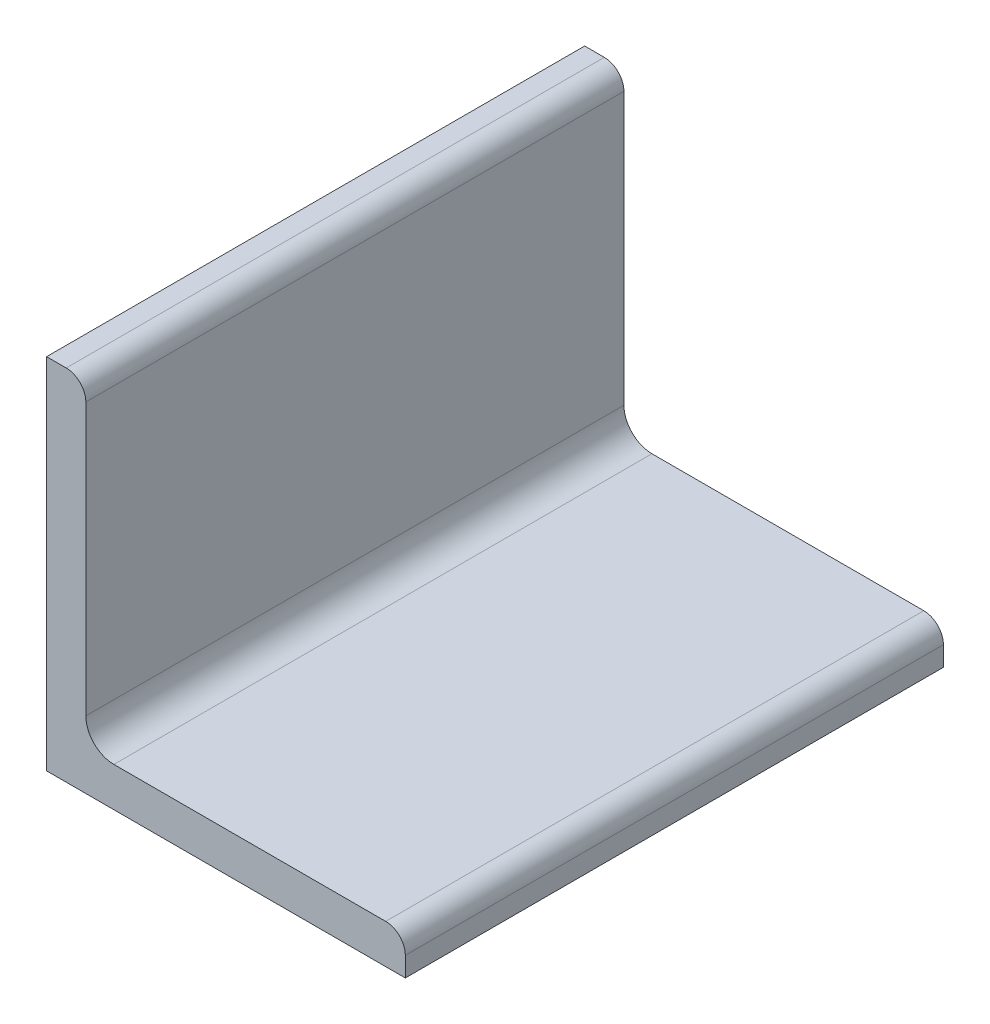
ISO-10303-21;
HEADER;
FILE_DESCRIPTION(('STEP AP214'),'2;1');
FILE_NAME('part.step','',(''),(''),'','','');
FILE_SCHEMA(('AUTOMOTIVE_DESIGN { 1 0 10303 214 1 1 1 1 }'));
ENDSEC;
DATA;
#1=APPLICATION_CONTEXT('core data for automotive mechanical design processes');
#2=APPLICATION_PROTOCOL_DEFINITION('international standard','automotive_design',2000,#1);
#3=PRODUCT_CONTEXT('',#1,'mechanical');
#4=PRODUCT('Part','Part','',(#3));
#5=PRODUCT_RELATED_PRODUCT_CATEGORY('part','',(#4));
#6=PRODUCT_DEFINITION_FORMATION('','',#4);
#7=PRODUCT_DEFINITION_CONTEXT('part definition',#1,'design');
#8=PRODUCT_DEFINITION('design','',#6,#7);
#9=PRODUCT_DEFINITION_SHAPE('','',#8);
#10=(LENGTH_UNIT() NAMED_UNIT(*) SI_UNIT(.MILLI.,.METRE.));
#11=(NAMED_UNIT(*) PLANE_ANGLE_UNIT() SI_UNIT($,.RADIAN.));
#12=(NAMED_UNIT(*) SI_UNIT($,.STERADIAN.) SOLID_ANGLE_UNIT());
#13=UNCERTAINTY_MEASURE_WITH_UNIT(LENGTH_MEASURE(1.E-05),#10,'distance_accuracy_value','');
#14=(GEOMETRIC_REPRESENTATION_CONTEXT(3) GLOBAL_UNCERTAINTY_ASSIGNED_CONTEXT((#13)) GLOBAL_UNIT_ASSIGNED_CONTEXT((#10,
#11,#12)) REPRESENTATION_CONTEXT('',''));
#15=CARTESIAN_POINT('',(0.,0.,0.));
#16=DIRECTION('',(0.,0.,1.));
#17=DIRECTION('',(1.,0.,0.));
#18=AXIS2_PLACEMENT_3D('',#15,#16,#17);
#19=CARTESIAN_POINT('',(1.17355224493876,203.678837479771,304.8));
#20=DIRECTION('',(1.,0.,0.));
#21=DIRECTION('',(0.,0.,-1.));
#22=AXIS2_PLACEMENT_3D('',#19,#20,#21);
#23=PLANE('',#22);
#24=DIRECTION('',(0.,-1.,0.));
#25=VECTOR('',#24,1.);
#26=CARTESIAN_POINT('',(1.17355224493876,203.678837479771,0.));
#27=LINE('',#26,#25);
#28=CARTESIAN_POINT('',(1.17355224493876,203.678837479771,0.));
#29=VERTEX_POINT('',#28);
#30=CARTESIAN_POINT('',(1.17355224493876,0.478837479771347,0.));
#31=VERTEX_POINT('',#30);
#32=EDGE_CURVE('E135',#29,#31,#27,.T.);
#33=ORIENTED_EDGE('',*,*,#32,.T.);
#34=DIRECTION('',(0.,0.,-1.));
#35=VECTOR('',#34,1.);
#36=CARTESIAN_POINT('',(1.17355224493876,0.478837479771347,304.8));
#37=LINE('',#36,#35);
#38=CARTESIAN_POINT('',(1.17355224493876,0.478837479771347,304.8));
#39=VERTEX_POINT('',#38);
#40=EDGE_CURVE('E11',#39,#31,#37,.T.);
#41=ORIENTED_EDGE('',*,*,#40,.F.);
#42=DIRECTION('',(0.,-1.,0.));
#43=VECTOR('',#42,1.);
#44=CARTESIAN_POINT('',(1.17355224493876,203.678837479771,304.8));
#45=LINE('',#44,#43);
#46=CARTESIAN_POINT('',(1.17355224493876,203.678837479771,304.8));
#47=VERTEX_POINT('',#46);
#48=EDGE_CURVE('E151',#47,#39,#45,.T.);
#49=ORIENTED_EDGE('',*,*,#48,.F.);
#50=DIRECTION('',(0.,0.,-1.));
#51=VECTOR('',#50,1.);
#52=CARTESIAN_POINT('',(1.17355224493876,203.678837479771,304.8));
#53=LINE('',#52,#51);
#54=EDGE_CURVE('E131',#47,#29,#53,.T.);
#55=ORIENTED_EDGE('',*,*,#54,.T.);
#56=EDGE_LOOP('',(#33,#41,#49,#55));
#57=FACE_BOUND('',#56,.T.);
#58=ADVANCED_FACE('F33',(#57),#23,.F.);
#59=CARTESIAN_POINT('',(1.17355224493876,0.478837479771347,304.8));
#60=DIRECTION('',(0.,1.,0.));
#61=DIRECTION('',(0.,0.,1.));
#62=AXIS2_PLACEMENT_3D('',#59,#60,#61);
#63=PLANE('',#62);
#64=DIRECTION('',(1.,0.,0.));
#65=VECTOR('',#64,1.);
#66=CARTESIAN_POINT('',(1.17355224493876,0.478837479771347,0.));
#67=LINE('',#66,#65);
#68=CARTESIAN_POINT('',(204.373552244939,0.478837479771347,0.));
#69=VERTEX_POINT('',#68);
#70=EDGE_CURVE('E138',#31,#69,#67,.T.);
#71=ORIENTED_EDGE('',*,*,#70,.T.);
#72=DIRECTION('',(0.,0.,-1.));
#73=VECTOR('',#72,1.);
#74=CARTESIAN_POINT('',(204.373552244939,0.478837479771347,304.8));
#75=LINE('',#74,#73);
#76=CARTESIAN_POINT('',(204.373552244939,0.478837479771347,304.8));
#77=VERTEX_POINT('',#76);
#78=EDGE_CURVE('E41',#77,#69,#75,.T.);
#79=ORIENTED_EDGE('',*,*,#78,.F.);
#80=DIRECTION('',(1.,0.,0.));
#81=VECTOR('',#80,1.);
#82=CARTESIAN_POINT('',(1.17355224493876,0.478837479771347,304.8));
#83=LINE('',#82,#81);
#84=EDGE_CURVE('E95',#39,#77,#83,.T.);
#85=ORIENTED_EDGE('',*,*,#84,.F.);
#86=ORIENTED_EDGE('',*,*,#40,.T.);
#87=EDGE_LOOP('',(#71,#79,#85,#86));
#88=FACE_BOUND('',#87,.T.);
#89=ADVANCED_FACE('F194',(#88),#63,.F.);
#90=CARTESIAN_POINT('',(204.373552244939,0.478837479771347,304.8));
#91=DIRECTION('',(-1.,0.,0.));
#92=DIRECTION('',(0.,0.,1.));
#93=AXIS2_PLACEMENT_3D('',#90,#91,#92);
#94=PLANE('',#93);
#95=DIRECTION('',(0.,1.,0.));
#96=VECTOR('',#95,1.);
#97=CARTESIAN_POINT('',(204.373552244939,0.478837479771347,0.));
#98=LINE('',#97,#96);
#99=CARTESIAN_POINT('',(204.373552244939,11.5913374797713,0.));
#100=VERTEX_POINT('',#99);
#101=EDGE_CURVE('E140',#69,#100,#98,.T.);
#102=ORIENTED_EDGE('',*,*,#101,.T.);
#103=DIRECTION('',(0.,0.,-1.));
#104=VECTOR('',#103,1.);
#105=CARTESIAN_POINT('',(204.373552244939,11.5913374797713,304.8));
#106=LINE('',#105,#104);
#107=CARTESIAN_POINT('',(204.373552244939,11.5913374797713,304.8));
#108=VERTEX_POINT('',#107);
#109=EDGE_CURVE('E161',#108,#100,#106,.T.);
#110=ORIENTED_EDGE('',*,*,#109,.F.);
#111=DIRECTION('',(0.,1.,0.));
#112=VECTOR('',#111,1.);
#113=CARTESIAN_POINT('',(204.373552244939,0.478837479771347,304.8));
#114=LINE('',#113,#112);
#115=EDGE_CURVE('E169',#77,#108,#114,.T.);
#116=ORIENTED_EDGE('',*,*,#115,.F.);
#117=ORIENTED_EDGE('',*,*,#78,.T.);
#118=EDGE_LOOP('',(#102,#110,#116,#117));
#119=FACE_BOUND('',#118,.T.);
#120=ADVANCED_FACE('F167',(#119),#94,.F.);
#121=CARTESIAN_POINT('',(193.261052244939,11.5913374797714,304.8));
#122=DIRECTION('',(0.,0.,-1.));
#123=DIRECTION('',(-1.,0.,0.));
#124=AXIS2_PLACEMENT_3D('',#121,#122,#123);
#125=CYLINDRICAL_SURFACE('',#124,11.1125);
#126=CARTESIAN_POINT('',(193.261052244939,11.5913374797714,0.));
#127=DIRECTION('',(0.,0.,1.));
#128=DIRECTION('',(1.,0.,0.));
#129=AXIS2_PLACEMENT_3D('',#126,#127,#128);
#130=CIRCLE('',#129,11.1125);
#131=CARTESIAN_POINT('',(193.261052244939,22.7038374797714,0.));
#132=VERTEX_POINT('',#131);
#133=EDGE_CURVE('E142',#100,#132,#130,.T.);
#134=ORIENTED_EDGE('',*,*,#133,.T.);
#135=DIRECTION('',(0.,0.,-1.));
#136=VECTOR('',#135,1.);
#137=CARTESIAN_POINT('',(193.261052244939,22.7038374797714,304.8));
#138=LINE('',#137,#136);
#139=CARTESIAN_POINT('',(193.261052244939,22.7038374797714,304.8));
#140=VERTEX_POINT('',#139);
#141=EDGE_CURVE('E158',#140,#132,#138,.T.);
#142=ORIENTED_EDGE('',*,*,#141,.F.);
#143=CARTESIAN_POINT('',(193.261052244939,11.5913374797714,304.8));
#144=DIRECTION('',(0.,0.,1.));
#145=DIRECTION('',(1.,0.,0.));
#146=AXIS2_PLACEMENT_3D('',#143,#144,#145);
#147=CIRCLE('',#146,11.1125);
#148=EDGE_CURVE('E185',#108,#140,#147,.T.);
#149=ORIENTED_EDGE('',*,*,#148,.F.);
#150=ORIENTED_EDGE('',*,*,#109,.T.);
#151=EDGE_LOOP('',(#134,#142,#149,#150));
#152=FACE_BOUND('',#151,.T.);
#153=ADVANCED_FACE('F178',(#152),#125,.T.);
#154=CARTESIAN_POINT('',(193.261052244939,22.7038374797713,304.8));
#155=DIRECTION('',(0.,-1.,0.));
#156=DIRECTION('',(1.,0.,0.));
#157=AXIS2_PLACEMENT_3D('',#154,#155,#156);
#158=PLANE('',#157);
#159=DIRECTION('',(-1.,0.,0.));
#160=VECTOR('',#159,1.);
#161=CARTESIAN_POINT('',(193.261052244939,22.7038374797713,0.));
#162=LINE('',#161,#160);
#163=CARTESIAN_POINT('',(39.2735522449388,22.7038374797714,0.));
#164=VERTEX_POINT('',#163);
#165=EDGE_CURVE('E144',#132,#164,#162,.T.);
#166=ORIENTED_EDGE('',*,*,#165,.T.);
#167=DIRECTION('',(0.,0.,-1.));
#168=VECTOR('',#167,1.);
#169=CARTESIAN_POINT('',(39.2735522449388,22.7038374797714,304.8));
#170=LINE('',#169,#168);
#171=CARTESIAN_POINT('',(39.2735522449388,22.7038374797714,304.8));
#172=VERTEX_POINT('',#171);
#173=EDGE_CURVE('E155',#172,#164,#170,.T.);
#174=ORIENTED_EDGE('',*,*,#173,.F.);
#175=DIRECTION('',(-1.,0.,0.));
#176=VECTOR('',#175,1.);
#177=CARTESIAN_POINT('',(193.261052244939,22.7038374797713,304.8));
#178=LINE('',#177,#176);
#179=EDGE_CURVE('E184',#140,#172,#178,.T.);
#180=ORIENTED_EDGE('',*,*,#179,.F.);
#181=ORIENTED_EDGE('',*,*,#141,.T.);
#182=EDGE_LOOP('',(#166,#174,#180,#181));
#183=FACE_BOUND('',#182,.T.);
#184=ADVANCED_FACE('F182',(#183),#158,.F.);
#185=CARTESIAN_POINT('',(39.2735522449387,38.5788374797713,304.8));
#186=DIRECTION('',(0.,0.,-1.));
#187=DIRECTION('',(-1.,0.,0.));
#188=AXIS2_PLACEMENT_3D('',#185,#186,#187);
#189=CYLINDRICAL_SURFACE('',#188,15.875);
#190=CARTESIAN_POINT('',(39.2735522449387,38.5788374797713,0.));
#191=DIRECTION('',(0.,0.,-1.));
#192=DIRECTION('',(1.,0.,0.));
#193=AXIS2_PLACEMENT_3D('',#190,#191,#192);
#194=CIRCLE('',#193,15.875);
#195=CARTESIAN_POINT('',(23.3985522449388,38.5788374797714,0.));
#196=VERTEX_POINT('',#195);
#197=EDGE_CURVE('E146',#164,#196,#194,.T.);
#198=ORIENTED_EDGE('',*,*,#197,.T.);
#199=DIRECTION('',(0.,0.,-1.));
#200=VECTOR('',#199,1.);
#201=CARTESIAN_POINT('',(23.3985522449388,38.5788374797714,304.8));
#202=LINE('',#201,#200);
#203=CARTESIAN_POINT('',(23.3985522449388,38.5788374797714,304.8));
#204=VERTEX_POINT('',#203);
#205=EDGE_CURVE('E126',#204,#196,#202,.T.);
#206=ORIENTED_EDGE('',*,*,#205,.F.);
#207=CARTESIAN_POINT('',(39.2735522449387,38.5788374797713,304.8));
#208=DIRECTION('',(0.,0.,-1.));
#209=DIRECTION('',(1.,0.,0.));
#210=AXIS2_PLACEMENT_3D('',#207,#208,#209);
#211=CIRCLE('',#210,15.875);
#212=EDGE_CURVE('E117',#172,#204,#211,.T.);
#213=ORIENTED_EDGE('',*,*,#212,.F.);
#214=ORIENTED_EDGE('',*,*,#173,.T.);
#215=EDGE_LOOP('',(#198,#206,#213,#214));
#216=FACE_BOUND('',#215,.T.);
#217=ADVANCED_FACE('F206',(#216),#189,.F.);
#218=CARTESIAN_POINT('',(23.3985522449388,38.5788374797714,304.8));
#219=DIRECTION('',(-1.,0.,0.));
#220=DIRECTION('',(0.,0.,1.));
#221=AXIS2_PLACEMENT_3D('',#218,#219,#220);
#222=PLANE('',#221);
#223=DIRECTION('',(0.,1.,0.));
#224=VECTOR('',#223,1.);
#225=CARTESIAN_POINT('',(23.3985522449388,38.5788374797714,0.));
#226=LINE('',#225,#224);
#227=CARTESIAN_POINT('',(23.3985522449388,192.566337479771,0.));
#228=VERTEX_POINT('',#227);
#229=EDGE_CURVE('E125',#196,#228,#226,.T.);
#230=ORIENTED_EDGE('',*,*,#229,.T.);
#231=DIRECTION('',(0.,0.,-1.));
#232=VECTOR('',#231,1.);
#233=CARTESIAN_POINT('',(23.3985522449388,192.566337479771,304.8));
#234=LINE('',#233,#232);
#235=CARTESIAN_POINT('',(23.3985522449388,192.566337479771,304.8));
#236=VERTEX_POINT('',#235);
#237=EDGE_CURVE('E122',#236,#228,#234,.T.);
#238=ORIENTED_EDGE('',*,*,#237,.F.);
#239=DIRECTION('',(0.,1.,0.));
#240=VECTOR('',#239,1.);
#241=CARTESIAN_POINT('',(23.3985522449388,38.5788374797714,304.8));
#242=LINE('',#241,#240);
#243=EDGE_CURVE('E111',#204,#236,#242,.T.);
#244=ORIENTED_EDGE('',*,*,#243,.F.);
#245=ORIENTED_EDGE('',*,*,#205,.T.);
#246=EDGE_LOOP('',(#230,#238,#244,#245));
#247=FACE_BOUND('',#246,.T.);
#248=ADVANCED_FACE('F123',(#247),#222,.F.);
#249=CARTESIAN_POINT('',(12.2860522449387,192.566337479771,304.8));
#250=DIRECTION('',(0.,0.,-1.));
#251=DIRECTION('',(-1.,0.,0.));
#252=AXIS2_PLACEMENT_3D('',#249,#250,#251);
#253=CYLINDRICAL_SURFACE('',#252,11.1125);
#254=CARTESIAN_POINT('',(12.2860522449387,192.566337479771,0.));
#255=DIRECTION('',(0.,0.,1.));
#256=DIRECTION('',(1.,0.,0.));
#257=AXIS2_PLACEMENT_3D('',#254,#255,#256);
#258=CIRCLE('',#257,11.1125);
#259=CARTESIAN_POINT('',(12.2860522449388,203.678837479771,0.));
#260=VERTEX_POINT('',#259);
#261=EDGE_CURVE('E81',#228,#260,#258,.T.);
#262=ORIENTED_EDGE('',*,*,#261,.T.);
#263=DIRECTION('',(0.,0.,-1.));
#264=VECTOR('',#263,1.);
#265=CARTESIAN_POINT('',(12.2860522449388,203.678837479771,304.8));
#266=LINE('',#265,#264);
#267=CARTESIAN_POINT('',(12.2860522449388,203.678837479771,304.8));
#268=VERTEX_POINT('',#267);
#269=EDGE_CURVE('E127',#268,#260,#266,.T.);
#270=ORIENTED_EDGE('',*,*,#269,.F.);
#271=CARTESIAN_POINT('',(12.2860522449387,192.566337479771,304.8));
#272=DIRECTION('',(0.,0.,1.));
#273=DIRECTION('',(1.,0.,0.));
#274=AXIS2_PLACEMENT_3D('',#271,#272,#273);
#275=CIRCLE('',#274,11.1125);
#276=EDGE_CURVE('E115',#236,#268,#275,.T.);
#277=ORIENTED_EDGE('',*,*,#276,.F.);
#278=ORIENTED_EDGE('',*,*,#237,.T.);
#279=EDGE_LOOP('',(#262,#270,#277,#278));
#280=FACE_BOUND('',#279,.T.);
#281=ADVANCED_FACE('F129',(#280),#253,.T.);
#282=CARTESIAN_POINT('',(12.2860522449388,203.678837479771,304.8));
#283=DIRECTION('',(0.,-1.,0.));
#284=DIRECTION('',(0.,0.,-1.));
#285=AXIS2_PLACEMENT_3D('',#282,#283,#284);
#286=PLANE('',#285);
#287=DIRECTION('',(-1.,0.,0.));
#288=VECTOR('',#287,1.);
#289=CARTESIAN_POINT('',(12.2860522449388,203.678837479771,0.));
#290=LINE('',#289,#288);
#291=EDGE_CURVE('E87',#260,#29,#290,.T.);
#292=ORIENTED_EDGE('',*,*,#291,.T.);
#293=ORIENTED_EDGE('',*,*,#54,.F.);
#294=DIRECTION('',(-1.,0.,0.));
#295=VECTOR('',#294,1.);
#296=CARTESIAN_POINT('',(12.2860522449388,203.678837479771,304.8));
#297=LINE('',#296,#295);
#298=EDGE_CURVE('E49',#268,#47,#297,.T.);
#299=ORIENTED_EDGE('',*,*,#298,.F.);
#300=ORIENTED_EDGE('',*,*,#269,.T.);
#301=EDGE_LOOP('',(#292,#293,#299,#300));
#302=FACE_BOUND('',#301,.T.);
#303=ADVANCED_FACE('F214',(#302),#286,.F.);
#304=CARTESIAN_POINT('',(193.261052244939,11.5913374797714,304.8));
#305=DIRECTION('',(0.,0.,1.));
#306=DIRECTION('',(1.,0.,0.));
#307=AXIS2_PLACEMENT_3D('',#304,#305,#306);
#308=PLANE('',#307);
#309=ORIENTED_EDGE('',*,*,#48,.T.);
#310=ORIENTED_EDGE('',*,*,#84,.T.);
#311=ORIENTED_EDGE('',*,*,#115,.T.);
#312=ORIENTED_EDGE('',*,*,#148,.T.);
#313=ORIENTED_EDGE('',*,*,#179,.T.);
#314=ORIENTED_EDGE('',*,*,#212,.T.);
#315=ORIENTED_EDGE('',*,*,#243,.T.);
#316=ORIENTED_EDGE('',*,*,#276,.T.);
#317=ORIENTED_EDGE('',*,*,#298,.T.);
#318=EDGE_LOOP('',(#309,#310,#311,#312,#313,#314,#315,#316,#317));
#319=FACE_BOUND('',#318,.T.);
#320=ADVANCED_FACE('F113',(#319),#308,.T.);
#321=CARTESIAN_POINT('',(193.261052244939,11.5913374797714,0.));
#322=DIRECTION('',(0.,0.,1.));
#323=DIRECTION('',(1.,0.,0.));
#324=AXIS2_PLACEMENT_3D('',#321,#322,#323);
#325=PLANE('',#324);
#326=ORIENTED_EDGE('',*,*,#32,.F.);
#327=ORIENTED_EDGE('',*,*,#291,.F.);
#328=ORIENTED_EDGE('',*,*,#261,.F.);
#329=ORIENTED_EDGE('',*,*,#229,.F.);
#330=ORIENTED_EDGE('',*,*,#197,.F.);
#331=ORIENTED_EDGE('',*,*,#165,.F.);
#332=ORIENTED_EDGE('',*,*,#133,.F.);
#333=ORIENTED_EDGE('',*,*,#101,.F.);
#334=ORIENTED_EDGE('',*,*,#70,.F.);
#335=EDGE_LOOP('',(#326,#327,#328,#329,#330,#331,#332,#333,#334));
#336=FACE_BOUND('',#335,.T.);
#337=ADVANCED_FACE('F173',(#336),#325,.F.);
#338=CLOSED_SHELL('',(#58,#89,#120,#153,#184,#217,#248,#281,#303,#320,#337));
#339=MANIFOLD_SOLID_BREP('B2',#338);
#340=ADVANCED_BREP_SHAPE_REPRESENTATION('',(#18,#339),#14);
#341=SHAPE_DEFINITION_REPRESENTATION(#9,#340);
ENDSEC;
END-ISO-10303-21;
